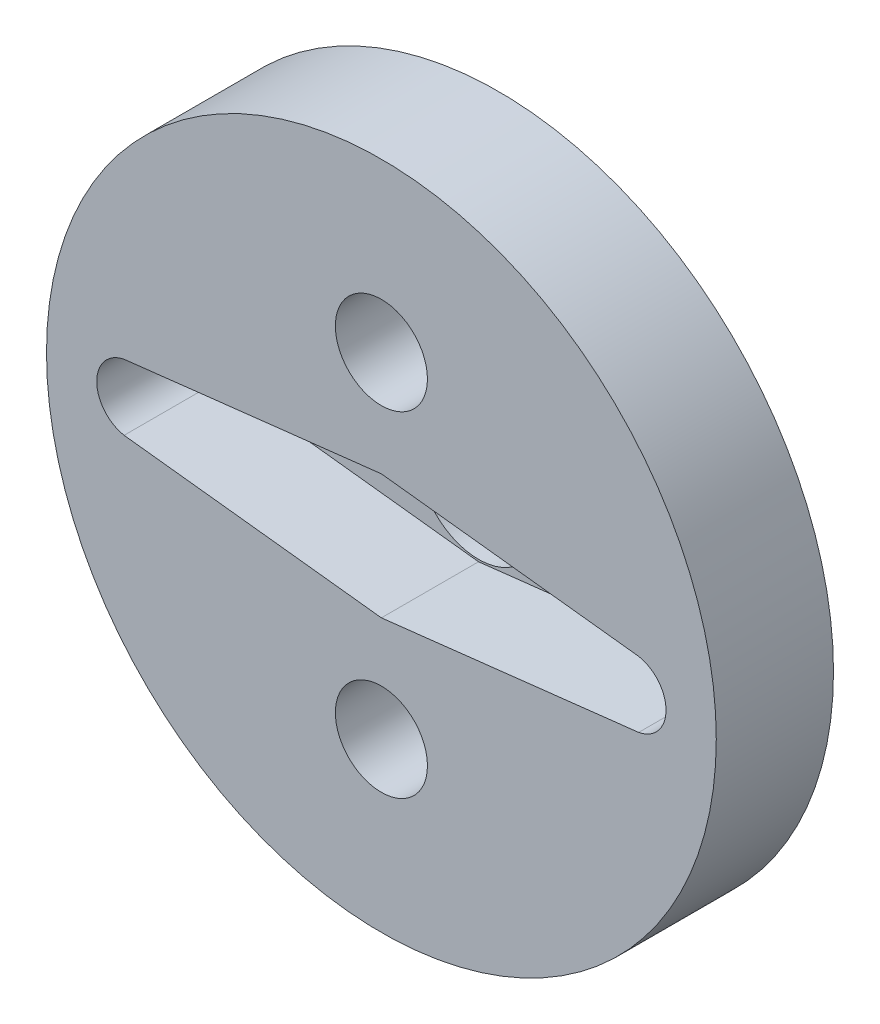
ISO-10303-21;
HEADER;
FILE_DESCRIPTION(('STEP AP214'),'2;1');
FILE_NAME('part.step','',(''),(''),'','','');
FILE_SCHEMA(('AUTOMOTIVE_DESIGN { 1 0 10303 214 1 1 1 1 }'));
ENDSEC;
DATA;
#1=APPLICATION_CONTEXT('core data for automotive mechanical design processes');
#2=APPLICATION_PROTOCOL_DEFINITION('international standard','automotive_design',2000,#1);
#3=PRODUCT_CONTEXT('',#1,'mechanical');
#4=PRODUCT('Part','Part','',(#3));
#5=PRODUCT_RELATED_PRODUCT_CATEGORY('part','',(#4));
#6=PRODUCT_DEFINITION_FORMATION('','',#4);
#7=PRODUCT_DEFINITION_CONTEXT('part definition',#1,'design');
#8=PRODUCT_DEFINITION('design','',#6,#7);
#9=PRODUCT_DEFINITION_SHAPE('','',#8);
#10=(LENGTH_UNIT() NAMED_UNIT(*) SI_UNIT(.MILLI.,.METRE.));
#11=(NAMED_UNIT(*) PLANE_ANGLE_UNIT() SI_UNIT($,.RADIAN.));
#12=(NAMED_UNIT(*) SI_UNIT($,.STERADIAN.) SOLID_ANGLE_UNIT());
#13=UNCERTAINTY_MEASURE_WITH_UNIT(LENGTH_MEASURE(1.E-05),#10,'distance_accuracy_value','');
#14=(GEOMETRIC_REPRESENTATION_CONTEXT(3) GLOBAL_UNCERTAINTY_ASSIGNED_CONTEXT((#13)) GLOBAL_UNIT_ASSIGNED_CONTEXT((#10,
#11,#12)) REPRESENTATION_CONTEXT('',''));
#15=CARTESIAN_POINT('',(0.,0.,0.));
#16=DIRECTION('',(0.,0.,1.));
#17=DIRECTION('',(1.,0.,0.));
#18=AXIS2_PLACEMENT_3D('',#15,#16,#17);
#19=CARTESIAN_POINT('',(7.3114484627872E-06,4.64266431529568E-06,45.0639905349175));
#20=DIRECTION('',(0.,0.,-1.));
#21=DIRECTION('',(-1.,0.,0.));
#22=AXIS2_PLACEMENT_3D('',#19,#20,#21);
#23=CYLINDRICAL_SURFACE('',#22,20.);
#24=CARTESIAN_POINT('',(7.3114484627872E-06,4.64266431529568E-06,9.70331160988214));
#25=DIRECTION('',(0.,0.,1.));
#26=DIRECTION('',(1.,0.,0.));
#27=AXIS2_PLACEMENT_3D('',#24,#25,#26);
#28=CIRCLE('',#27,20.);
#29=CARTESIAN_POINT('',(20.0000073114485,4.64266431529568E-06,9.70331160988214));
#30=VERTEX_POINT('',#29);
#31=EDGE_CURVE('E67',#30,#30,#28,.T.);
#32=ORIENTED_EDGE('',*,*,#31,.T.);
#33=EDGE_LOOP('',(#32));
#34=FACE_BOUND('',#33,.T.);
#35=CARTESIAN_POINT('',(7.3114484627872E-06,4.64266431529568E-06,16.7033116098821));
#36=DIRECTION('',(0.,0.,1.));
#37=DIRECTION('',(1.,0.,0.));
#38=AXIS2_PLACEMENT_3D('',#35,#36,#37);
#39=CIRCLE('',#38,20.);
#40=CARTESIAN_POINT('',(20.0000073114485,4.64266431529568E-06,16.7033116098821));
#41=VERTEX_POINT('',#40);
#42=EDGE_CURVE('E122',#41,#41,#39,.T.);
#43=ORIENTED_EDGE('',*,*,#42,.F.);
#44=EDGE_LOOP('',(#43));
#45=FACE_BOUND('',#44,.T.);
#46=ADVANCED_FACE('F59',(#34,#45),#23,.T.);
#47=CARTESIAN_POINT('',(15.0000000000054,0.,10.9033116098821));
#48=DIRECTION('',(0.,0.,1.));
#49=DIRECTION('',(1.,0.,0.));
#50=AXIS2_PLACEMENT_3D('',#47,#48,#49);
#51=CYLINDRICAL_SURFACE('',#50,2.);
#52=CARTESIAN_POINT('',(15.0000000000054,0.,16.7033116098821));
#53=DIRECTION('',(0.,0.,1.));
#54=DIRECTION('',(1.,0.,0.));
#55=AXIS2_PLACEMENT_3D('',#52,#53,#54);
#56=CIRCLE('',#55,2.);
#57=CARTESIAN_POINT('',(15.3650749142276,1.96639779978662,16.7033116098821));
#58=VERTEX_POINT('',#57);
#59=CARTESIAN_POINT('',(15.3650846141353,-1.96639599890907,16.7033116098821));
#60=VERTEX_POINT('',#59);
#61=EDGE_CURVE('E113',#58,#60,#56,.F.);
#62=ORIENTED_EDGE('',*,*,#61,.F.);
#63=DIRECTION('',(0.,0.,1.));
#64=VECTOR('',#63,1.);
#65=CARTESIAN_POINT('',(15.3650749142276,1.96639779978662,10.9033116098821));
#66=LINE('',#65,#64);
#67=CARTESIAN_POINT('',(15.3650749142276,1.96639779978662,10.9033116098821));
#68=VERTEX_POINT('',#67);
#69=EDGE_CURVE('E119',#68,#58,#66,.T.);
#70=ORIENTED_EDGE('',*,*,#69,.F.);
#71=CARTESIAN_POINT('',(15.0000000000054,0.,10.9033116098821));
#72=DIRECTION('',(0.,0.,1.));
#73=DIRECTION('',(-1.,0.,0.));
#74=AXIS2_PLACEMENT_3D('',#71,#72,#73);
#75=CIRCLE('',#74,2.);
#76=CARTESIAN_POINT('',(15.3650846141353,-1.96639599890907,10.9033116098821));
#77=VERTEX_POINT('',#76);
#78=EDGE_CURVE('E147',#77,#68,#75,.T.);
#79=ORIENTED_EDGE('',*,*,#78,.F.);
#80=DIRECTION('',(0.,0.,1.));
#81=VECTOR('',#80,1.);
#82=CARTESIAN_POINT('',(15.3650846141353,-1.96639599890907,10.9033116098821));
#83=LINE('',#82,#81);
#84=EDGE_CURVE('E81',#77,#60,#83,.T.);
#85=ORIENTED_EDGE('',*,*,#84,.T.);
#86=EDGE_LOOP('',(#62,#70,#79,#85));
#87=FACE_BOUND('',#86,.T.);
#88=ADVANCED_FACE('F118',(#87),#51,.F.);
#89=CARTESIAN_POINT('',(15.3650846141353,-1.96639599890907,10.9033116098821));
#90=DIRECTION('',(0.113651255882556,-0.99352070538883,0.));
#91=DIRECTION('',(0.99352070538883,0.113651255882556,0.));
#92=AXIS2_PLACEMENT_3D('',#89,#90,#91);
#93=PLANE('',#92);
#94=DIRECTION('',(-0.99352070538883,-0.113651255882556,0.));
#95=VECTOR('',#94,1.);
#96=CARTESIAN_POINT('',(15.3650846141353,-1.96639599890907,16.7033116098821));
#97=LINE('',#96,#95);
#98=CARTESIAN_POINT('',(0.,-3.72404549092925,16.7033116098821));
#99=VERTEX_POINT('',#98);
#100=EDGE_CURVE('E123',#60,#99,#97,.T.);
#101=ORIENTED_EDGE('',*,*,#100,.F.);
#102=ORIENTED_EDGE('',*,*,#84,.F.);
#103=DIRECTION('',(0.99352070538883,0.113651255882556,0.));
#104=VECTOR('',#103,1.);
#105=CARTESIAN_POINT('',(15.3650846141353,-1.96639599890907,10.9033116098821));
#106=LINE('',#105,#104);
#107=CARTESIAN_POINT('',(0.,-3.72404549092925,10.9033116098821));
#108=VERTEX_POINT('',#107);
#109=EDGE_CURVE('E131',#108,#77,#106,.T.);
#110=ORIENTED_EDGE('',*,*,#109,.F.);
#111=DIRECTION('',(0.,0.,1.));
#112=VECTOR('',#111,1.);
#113=CARTESIAN_POINT('',(0.,-3.72404549092925,10.9033116098821));
#114=LINE('',#113,#112);
#115=EDGE_CURVE('E177',#108,#99,#114,.T.);
#116=ORIENTED_EDGE('',*,*,#115,.T.);
#117=EDGE_LOOP('',(#101,#102,#110,#116));
#118=FACE_BOUND('',#117,.T.);
#119=ADVANCED_FACE('F215',(#118),#93,.F.);
#120=CARTESIAN_POINT('',(-15.3650846141353,-1.96639599890907,10.9033116098821));
#121=DIRECTION('',(-0.113651255882555,-0.99352070538883,0.));
#122=DIRECTION('',(0.99352070538883,-0.113651255882556,0.));
#123=AXIS2_PLACEMENT_3D('',#120,#121,#122);
#124=PLANE('',#123);
#125=DIRECTION('',(-0.99352070538883,0.113651255882556,0.));
#126=VECTOR('',#125,1.);
#127=CARTESIAN_POINT('',(-15.3650846141353,-1.96639599890907,16.7033116098821));
#128=LINE('',#127,#126);
#129=CARTESIAN_POINT('',(-15.3650846141353,-1.96639599890907,16.7033116098821));
#130=VERTEX_POINT('',#129);
#131=EDGE_CURVE('E199',#99,#130,#128,.T.);
#132=ORIENTED_EDGE('',*,*,#131,.F.);
#133=ORIENTED_EDGE('',*,*,#115,.F.);
#134=DIRECTION('',(0.99352070538883,-0.113651255882555,0.));
#135=VECTOR('',#134,1.);
#136=CARTESIAN_POINT('',(-15.3650846141353,-1.96639599890907,10.9033116098821));
#137=LINE('',#136,#135);
#138=CARTESIAN_POINT('',(-15.3650846141353,-1.96639599890907,10.9033116098821));
#139=VERTEX_POINT('',#138);
#140=EDGE_CURVE('E138',#139,#108,#137,.T.);
#141=ORIENTED_EDGE('',*,*,#140,.F.);
#142=DIRECTION('',(0.,0.,1.));
#143=VECTOR('',#142,1.);
#144=CARTESIAN_POINT('',(-15.3650846141353,-1.96639599890907,10.9033116098821));
#145=LINE('',#144,#143);
#146=EDGE_CURVE('E181',#139,#130,#145,.T.);
#147=ORIENTED_EDGE('',*,*,#146,.T.);
#148=EDGE_LOOP('',(#132,#133,#141,#147));
#149=FACE_BOUND('',#148,.T.);
#150=ADVANCED_FACE('F213',(#149),#124,.F.);
#151=CARTESIAN_POINT('',(-15.0000000000054,0.,10.9033116098821));
#152=DIRECTION('',(0.,0.,1.));
#153=DIRECTION('',(1.,0.,0.));
#154=AXIS2_PLACEMENT_3D('',#151,#152,#153);
#155=CYLINDRICAL_SURFACE('',#154,2.);
#156=CARTESIAN_POINT('',(-15.0000000000054,0.,16.7033116098821));
#157=DIRECTION('',(0.,0.,1.));
#158=DIRECTION('',(1.,0.,0.));
#159=AXIS2_PLACEMENT_3D('',#156,#157,#158);
#160=CIRCLE('',#159,2.);
#161=CARTESIAN_POINT('',(-15.3650749142276,1.96639779978661,16.7033116098821));
#162=VERTEX_POINT('',#161);
#163=EDGE_CURVE('E190',#130,#162,#160,.F.);
#164=ORIENTED_EDGE('',*,*,#163,.F.);
#165=ORIENTED_EDGE('',*,*,#146,.F.);
#166=CARTESIAN_POINT('',(-15.0000000000054,0.,10.9033116098821));
#167=DIRECTION('',(0.,0.,1.));
#168=DIRECTION('',(1.,0.,0.));
#169=AXIS2_PLACEMENT_3D('',#166,#167,#168);
#170=CIRCLE('',#169,2.);
#171=CARTESIAN_POINT('',(-15.3650749142276,1.96639779978661,10.9033116098821));
#172=VERTEX_POINT('',#171);
#173=EDGE_CURVE('E168',#172,#139,#170,.T.);
#174=ORIENTED_EDGE('',*,*,#173,.F.);
#175=DIRECTION('',(0.,0.,1.));
#176=VECTOR('',#175,1.);
#177=CARTESIAN_POINT('',(-15.3650749142276,1.96639779978661,10.9033116098821));
#178=LINE('',#177,#176);
#179=EDGE_CURVE('E135',#172,#162,#178,.T.);
#180=ORIENTED_EDGE('',*,*,#179,.T.);
#181=EDGE_LOOP('',(#164,#165,#174,#180));
#182=FACE_BOUND('',#181,.T.);
#183=ADVANCED_FACE('F189',(#182),#155,.F.);
#184=CARTESIAN_POINT('',(-15.3650749142276,1.96639779978661,10.9033116098821));
#185=DIRECTION('',(-0.113656738672884,0.993520078183749,0.));
#186=DIRECTION('',(-0.99352007818375,-0.113656738672884,0.));
#187=AXIS2_PLACEMENT_3D('',#184,#185,#186);
#188=PLANE('',#187);
#189=DIRECTION('',(0.99352007818375,0.113656738672884,0.));
#190=VECTOR('',#189,1.);
#191=CARTESIAN_POINT('',(-15.3650749142276,1.96639779978661,16.7033116098821));
#192=LINE('',#191,#190);
#193=CARTESIAN_POINT('',(0.,3.72413208474252,16.7033116098821));
#194=VERTEX_POINT('',#193);
#195=EDGE_CURVE('E73',#162,#194,#192,.T.);
#196=ORIENTED_EDGE('',*,*,#195,.F.);
#197=ORIENTED_EDGE('',*,*,#179,.F.);
#198=DIRECTION('',(-0.993520078183749,-0.113656738672884,0.));
#199=VECTOR('',#198,1.);
#200=CARTESIAN_POINT('',(-15.3650749142276,1.96639779978661,10.9033116098821));
#201=LINE('',#200,#199);
#202=CARTESIAN_POINT('',(0.,3.72413208474252,10.9033116098821));
#203=VERTEX_POINT('',#202);
#204=EDGE_CURVE('E164',#203,#172,#201,.T.);
#205=ORIENTED_EDGE('',*,*,#204,.F.);
#206=DIRECTION('',(0.,0.,1.));
#207=VECTOR('',#206,1.);
#208=CARTESIAN_POINT('',(0.,3.72413208474252,10.9033116098821));
#209=LINE('',#208,#207);
#210=EDGE_CURVE('E130',#203,#194,#209,.T.);
#211=ORIENTED_EDGE('',*,*,#210,.T.);
#212=EDGE_LOOP('',(#196,#197,#205,#211));
#213=FACE_BOUND('',#212,.T.);
#214=ADVANCED_FACE('F193',(#213),#188,.F.);
#215=CARTESIAN_POINT('',(15.3650749142276,1.96639779978662,10.9033116098821));
#216=DIRECTION('',(0.113656738672884,0.99352007818375,0.));
#217=DIRECTION('',(-0.99352007818375,0.113656738672884,0.));
#218=AXIS2_PLACEMENT_3D('',#215,#216,#217);
#219=PLANE('',#218);
#220=DIRECTION('',(0.99352007818375,-0.113656738672884,0.));
#221=VECTOR('',#220,1.);
#222=CARTESIAN_POINT('',(15.3650749142276,1.96639779978662,16.7033116098821));
#223=LINE('',#222,#221);
#224=EDGE_CURVE('E12',#194,#58,#223,.T.);
#225=ORIENTED_EDGE('',*,*,#224,.F.);
#226=ORIENTED_EDGE('',*,*,#210,.F.);
#227=DIRECTION('',(-0.99352007818375,0.113656738672884,0.));
#228=VECTOR('',#227,1.);
#229=CARTESIAN_POINT('',(15.3650749142276,1.96639779978662,10.9033116098821));
#230=LINE('',#229,#228);
#231=EDGE_CURVE('E127',#68,#203,#230,.T.);
#232=ORIENTED_EDGE('',*,*,#231,.F.);
#233=ORIENTED_EDGE('',*,*,#69,.T.);
#234=EDGE_LOOP('',(#225,#226,#232,#233));
#235=FACE_BOUND('',#234,.T.);
#236=ADVANCED_FACE('F125',(#235),#219,.F.);
#237=CARTESIAN_POINT('',(7.3114484627872E-06,4.64266431529568E-06,9.70331160988214));
#238=DIRECTION('',(0.,0.,1.));
#239=DIRECTION('',(1.,0.,0.));
#240=AXIS2_PLACEMENT_3D('',#237,#238,#239);
#241=PLANE('',#240);
#242=CARTESIAN_POINT('',(7.3114484627874E-06,4.64266431530092E-06,9.70331160988214));
#243=DIRECTION('',(0.,0.,-1.));
#244=DIRECTION('',(-1.,0.,0.));
#245=AXIS2_PLACEMENT_3D('',#242,#243,#244);
#246=CIRCLE('',#245,3.6);
#247=CARTESIAN_POINT('',(-3.59999268855154,4.64266431530092E-06,9.70331160988214));
#248=VERTEX_POINT('',#247);
#249=EDGE_CURVE('E148',#248,#248,#246,.T.);
#250=ORIENTED_EDGE('',*,*,#249,.F.);
#251=EDGE_LOOP('',(#250));
#252=FACE_BOUND('',#251,.T.);
#253=ORIENTED_EDGE('',*,*,#31,.F.);
#254=EDGE_LOOP('',(#253));
#255=FACE_BOUND('',#254,.T.);
#256=ADVANCED_FACE('F220',(#252,#255),#241,.F.);
#257=CARTESIAN_POINT('',(15.0000000000054,0.,10.9033116098821));
#258=DIRECTION('',(0.,0.,-1.));
#259=DIRECTION('',(-1.,0.,0.));
#260=AXIS2_PLACEMENT_3D('',#257,#258,#259);
#261=PLANE('',#260);
#262=CARTESIAN_POINT('',(7.3114484627874E-06,4.64266431530092E-06,10.9033116098821));
#263=DIRECTION('',(0.,0.,-1.));
#264=DIRECTION('',(-1.,0.,0.));
#265=AXIS2_PLACEMENT_3D('',#262,#263,#264);
#266=CIRCLE('',#265,3.6);
#267=CARTESIAN_POINT('',(-3.59999268855154,4.64266431530092E-06,10.9033116098821));
#268=VERTEX_POINT('',#267);
#269=EDGE_CURVE('E144',#268,#268,#266,.T.);
#270=ORIENTED_EDGE('',*,*,#269,.T.);
#271=EDGE_LOOP('',(#270));
#272=FACE_BOUND('',#271,.T.);
#273=ORIENTED_EDGE('',*,*,#78,.T.);
#274=ORIENTED_EDGE('',*,*,#231,.T.);
#275=ORIENTED_EDGE('',*,*,#204,.T.);
#276=ORIENTED_EDGE('',*,*,#173,.T.);
#277=ORIENTED_EDGE('',*,*,#140,.T.);
#278=ORIENTED_EDGE('',*,*,#109,.T.);
#279=EDGE_LOOP('',(#273,#274,#275,#276,#277,#278));
#280=FACE_BOUND('',#279,.T.);
#281=ADVANCED_FACE('F217',(#272,#280),#261,.F.);
#282=CARTESIAN_POINT('',(7.3114484627874E-06,4.64266431530092E-06,15.1033116098821));
#283=DIRECTION('',(0.,0.,-1.));
#284=DIRECTION('',(-1.,0.,0.));
#285=AXIS2_PLACEMENT_3D('',#282,#283,#284);
#286=CYLINDRICAL_SURFACE('',#285,3.6);
#287=CARTESIAN_POINT('',(-3.59999268855154,4.64266431530092E-06,9.70331160988214));
#288=CARTESIAN_POINT('',(-3.59999268855154,4.64266431530092E-06,9.71581160988214));
#289=CARTESIAN_POINT('',(-3.59999268855154,4.64266431530092E-06,9.72831160988214));
#290=CARTESIAN_POINT('',(-3.59999268855154,4.64266431530092E-06,9.75331160988214));
#291=CARTESIAN_POINT('',(-3.59999268855154,4.64266431530092E-06,9.76581160988214));
#292=CARTESIAN_POINT('',(-3.59999268855154,4.64266431530092E-06,9.79081160988214));
#293=CARTESIAN_POINT('',(-3.59999268855154,4.64266431530092E-06,9.80331160988214));
#294=CARTESIAN_POINT('',(-3.59999268855154,4.64266431530092E-06,9.82831160988214));
#295=CARTESIAN_POINT('',(-3.59999268855154,4.64266431530092E-06,9.84081160988214));
#296=CARTESIAN_POINT('',(-3.59999268855154,4.64266431530092E-06,9.86581160988214));
#297=CARTESIAN_POINT('',(-3.59999268855154,4.64266431530092E-06,9.87831160988214));
#298=CARTESIAN_POINT('',(-3.59999268855154,4.64266431530092E-06,9.90331160988214));
#299=CARTESIAN_POINT('',(-3.59999268855154,4.64266431530092E-06,9.91581160988214));
#300=CARTESIAN_POINT('',(-3.59999268855154,4.64266431530092E-06,9.94081160988214));
#301=CARTESIAN_POINT('',(-3.59999268855154,4.64266431530092E-06,9.95331160988214));
#302=CARTESIAN_POINT('',(-3.59999268855154,4.64266431530092E-06,9.97831160988214));
#303=CARTESIAN_POINT('',(-3.59999268855154,4.64266431530092E-06,9.99081160988214));
#304=CARTESIAN_POINT('',(-3.59999268855154,4.64266431530092E-06,10.0158116098821));
#305=CARTESIAN_POINT('',(-3.59999268855154,4.64266431530092E-06,10.0283116098821));
#306=CARTESIAN_POINT('',(-3.59999268855154,4.64266431530092E-06,10.0533116098821));
#307=CARTESIAN_POINT('',(-3.59999268855154,4.64266431530092E-06,10.0658116098821));
#308=CARTESIAN_POINT('',(-3.59999268855154,4.64266431530092E-06,10.0908116098821));
#309=CARTESIAN_POINT('',(-3.59999268855154,4.64266431530092E-06,10.1033116098821));
#310=CARTESIAN_POINT('',(-3.59999268855154,4.64266431530092E-06,10.1283116098821));
#311=CARTESIAN_POINT('',(-3.59999268855154,4.64266431530092E-06,10.1408116098821));
#312=CARTESIAN_POINT('',(-3.59999268855154,4.64266431530092E-06,10.1658116098821));
#313=CARTESIAN_POINT('',(-3.59999268855154,4.64266431530092E-06,10.1783116098821));
#314=CARTESIAN_POINT('',(-3.59999268855154,4.64266431530092E-06,10.2033116098821));
#315=CARTESIAN_POINT('',(-3.59999268855154,4.64266431530092E-06,10.2158116098821));
#316=CARTESIAN_POINT('',(-3.59999268855154,4.64266431530092E-06,10.2408116098821));
#317=CARTESIAN_POINT('',(-3.59999268855154,4.64266431530092E-06,10.2533116098821));
#318=CARTESIAN_POINT('',(-3.59999268855154,4.64266431530092E-06,10.2783116098821));
#319=CARTESIAN_POINT('',(-3.59999268855154,4.64266431530092E-06,10.2908116098821));
#320=CARTESIAN_POINT('',(-3.59999268855154,4.64266431530092E-06,10.3158116098821));
#321=CARTESIAN_POINT('',(-3.59999268855154,4.64266431530092E-06,10.3283116098821));
#322=CARTESIAN_POINT('',(-3.59999268855154,4.64266431530092E-06,10.3533116098821));
#323=CARTESIAN_POINT('',(-3.59999268855154,4.64266431530092E-06,10.3658116098821));
#324=CARTESIAN_POINT('',(-3.59999268855154,4.64266431530092E-06,10.3908116098821));
#325=CARTESIAN_POINT('',(-3.59999268855154,4.64266431530092E-06,10.4033116098821));
#326=CARTESIAN_POINT('',(-3.59999268855154,4.64266431530092E-06,10.4283116098821));
#327=CARTESIAN_POINT('',(-3.59999268855154,4.64266431530092E-06,10.4408116098821));
#328=CARTESIAN_POINT('',(-3.59999268855154,4.64266431530092E-06,10.4658116098821));
#329=CARTESIAN_POINT('',(-3.59999268855154,4.64266431530092E-06,10.4783116098821));
#330=CARTESIAN_POINT('',(-3.59999268855154,4.64266431530092E-06,10.5033116098821));
#331=CARTESIAN_POINT('',(-3.59999268855154,4.64266431530092E-06,10.5158116098821));
#332=CARTESIAN_POINT('',(-3.59999268855154,4.64266431530092E-06,10.5408116098821));
#333=CARTESIAN_POINT('',(-3.59999268855154,4.64266431530092E-06,10.5533116098821));
#334=CARTESIAN_POINT('',(-3.59999268855154,4.64266431530092E-06,10.5783116098821));
#335=CARTESIAN_POINT('',(-3.59999268855154,4.64266431530092E-06,10.5908116098821));
#336=CARTESIAN_POINT('',(-3.59999268855154,4.64266431530092E-06,10.6158116098821));
#337=CARTESIAN_POINT('',(-3.59999268855154,4.64266431530092E-06,10.6283116098821));
#338=CARTESIAN_POINT('',(-3.59999268855154,4.64266431530092E-06,10.6533116098821));
#339=CARTESIAN_POINT('',(-3.59999268855154,4.64266431530092E-06,10.6658116098821));
#340=CARTESIAN_POINT('',(-3.59999268855154,4.64266431530092E-06,10.6908116098821));
#341=CARTESIAN_POINT('',(-3.59999268855154,4.64266431530092E-06,10.7033116098821));
#342=CARTESIAN_POINT('',(-3.59999268855154,4.64266431530092E-06,10.7283116098821));
#343=CARTESIAN_POINT('',(-3.59999268855154,4.64266431530092E-06,10.7408116098821));
#344=CARTESIAN_POINT('',(-3.59999268855154,4.64266431530092E-06,10.7658116098821));
#345=CARTESIAN_POINT('',(-3.59999268855154,4.64266431530092E-06,10.7783116098821));
#346=CARTESIAN_POINT('',(-3.59999268855154,4.64266431530092E-06,10.8033116098821));
#347=CARTESIAN_POINT('',(-3.59999268855154,4.64266431530092E-06,10.8158116098821));
#348=CARTESIAN_POINT('',(-3.59999268855154,4.64266431530092E-06,10.8408116098821));
#349=CARTESIAN_POINT('',(-3.59999268855154,4.64266431530092E-06,10.8533116098821));
#350=CARTESIAN_POINT('',(-3.59999268855154,4.64266431530092E-06,10.8783116098821));
#351=CARTESIAN_POINT('',(-3.59999268855154,4.64266431530092E-06,10.8908116098821));
#352=CARTESIAN_POINT('',(-3.59999268855154,4.64266431530092E-06,10.9033116098821));
#353=B_SPLINE_CURVE_WITH_KNOTS('',3,(#287,#288,#289,#290,#291,#292,#293,#294,#295,#296,#297,
#298,#299,#300,#301,#302,#303,#304,#305,#306,#307,#308,#309,#310,#311,#312,#313,#314,#315,#316,
#317,#318,#319,#320,#321,#322,#323,#324,#325,#326,#327,#328,#329,#330,#331,#332,#333,#334,#335,
#336,#337,#338,#339,#340,#341,#342,#343,#344,#345,#346,#347,#348,#349,#350,#351,#352),
.UNSPECIFIED.,.F.,.F.,(4,2,2,2,2,2,2,2,2,2,2,2,2,2,2,2,2,2,2,2,2,2,2,2,2,2,2,2,2,2,2,2,4),(0.,
0.0375000000000011,0.0750000000000021,0.112500000000001,0.150000000000001,0.1875,0.225,
0.262500000000001,0.300000000000002,0.337500000000001,0.375,0.4125,0.450000000000001,
0.487500000000002,0.525000000000001,0.5625,0.6,0.637500000000001,0.675000000000002,
0.712500000000001,0.750000000000001,0.7875,0.824999999999999,0.8625,0.900000000000001,
0.937500000000001,0.975,1.0125,1.05,1.0875,1.125,1.1625,1.2),.UNSPECIFIED.);
#354=EDGE_CURVE('BSEAM219',#248,#268,#353,.T.);
#355=ORIENTED_EDGE('',*,*,#249,.T.);
#356=ORIENTED_EDGE('',*,*,#269,.F.);
#357=ORIENTED_EDGE('',*,*,#354,.T.);
#358=ORIENTED_EDGE('',*,*,#354,.F.);
#359=EDGE_LOOP('',(#355,#357,#356,#358));
#360=FACE_BOUND('',#359,.T.);
#361=ADVANCED_FACE('F219',(#360),#286,.F.);
#362=CARTESIAN_POINT('',(0.00935962319433556,0.215183115524063,16.7033116098821));
#363=DIRECTION('',(0.,0.,1.));
#364=DIRECTION('',(1.,0.,0.));
#365=AXIS2_PLACEMENT_3D('',#362,#363,#364);
#366=PLANE('',#365);
#367=CARTESIAN_POINT('',(0.,10.,16.7033116098821));
#368=DIRECTION('',(0.,0.,1.));
#369=DIRECTION('',(1.,0.,0.));
#370=AXIS2_PLACEMENT_3D('',#367,#368,#369);
#371=CIRCLE('',#370,2.75);
#372=CARTESIAN_POINT('',(2.75,10.,16.7033116098821));
#373=VERTEX_POINT('',#372);
#374=EDGE_CURVE('E202',#373,#373,#371,.T.);
#375=ORIENTED_EDGE('',*,*,#374,.F.);
#376=EDGE_LOOP('',(#375));
#377=FACE_BOUND('',#376,.T.);
#378=CARTESIAN_POINT('',(0.,-10.,16.7033116098821));
#379=DIRECTION('',(0.,0.,1.));
#380=DIRECTION('',(1.,0.,0.));
#381=AXIS2_PLACEMENT_3D('',#378,#379,#380);
#382=CIRCLE('',#381,2.75);
#383=CARTESIAN_POINT('',(2.75,-10.,16.7033116098821));
#384=VERTEX_POINT('',#383);
#385=EDGE_CURVE('E205',#384,#384,#382,.T.);
#386=ORIENTED_EDGE('',*,*,#385,.F.);
#387=EDGE_LOOP('',(#386));
#388=FACE_BOUND('',#387,.T.);
#389=ORIENTED_EDGE('',*,*,#61,.T.);
#390=ORIENTED_EDGE('',*,*,#100,.T.);
#391=ORIENTED_EDGE('',*,*,#131,.T.);
#392=ORIENTED_EDGE('',*,*,#163,.T.);
#393=ORIENTED_EDGE('',*,*,#195,.T.);
#394=ORIENTED_EDGE('',*,*,#224,.T.);
#395=EDGE_LOOP('',(#389,#390,#391,#392,#393,#394));
#396=FACE_BOUND('',#395,.T.);
#397=ORIENTED_EDGE('',*,*,#42,.T.);
#398=EDGE_LOOP('',(#397));
#399=FACE_BOUND('',#398,.T.);
#400=ADVANCED_FACE('F111',(#377,#388,#396,#399),#366,.T.);
#401=CARTESIAN_POINT('',(0.,-10.,10.7033116098821));
#402=DIRECTION('',(0.,0.,1.));
#403=DIRECTION('',(1.,0.,0.));
#404=AXIS2_PLACEMENT_3D('',#401,#402,#403);
#405=CYLINDRICAL_SURFACE('',#404,2.75);
#406=CARTESIAN_POINT('',(0.,-10.,10.7033116098821));
#407=DIRECTION('',(0.,0.,1.));
#408=DIRECTION('',(1.,0.,0.));
#409=AXIS2_PLACEMENT_3D('',#406,#407,#408);
#410=CIRCLE('',#409,2.75);
#411=CARTESIAN_POINT('',(2.75,-10.,10.7033116098821));
#412=VERTEX_POINT('',#411);
#413=EDGE_CURVE('E267',#412,#412,#410,.T.);
#414=ORIENTED_EDGE('',*,*,#413,.F.);
#415=EDGE_LOOP('',(#414));
#416=FACE_BOUND('',#415,.T.);
#417=ORIENTED_EDGE('',*,*,#385,.T.);
#418=EDGE_LOOP('',(#417));
#419=FACE_BOUND('',#418,.T.);
#420=ADVANCED_FACE('F239',(#416,#419),#405,.F.);
#421=CARTESIAN_POINT('',(0.,-10.,10.7033116098821));
#422=DIRECTION('',(0.,0.,1.));
#423=DIRECTION('',(1.,0.,0.));
#424=AXIS2_PLACEMENT_3D('',#421,#422,#423);
#425=PLANE('',#424);
#426=ORIENTED_EDGE('',*,*,#413,.T.);
#427=EDGE_LOOP('',(#426));
#428=FACE_BOUND('',#427,.T.);
#429=ADVANCED_FACE('F245',(#428),#425,.T.);
#430=CARTESIAN_POINT('',(0.,10.,10.7033116098821));
#431=DIRECTION('',(0.,0.,1.));
#432=DIRECTION('',(1.,0.,0.));
#433=AXIS2_PLACEMENT_3D('',#430,#431,#432);
#434=CYLINDRICAL_SURFACE('',#433,2.75);
#435=CARTESIAN_POINT('',(0.,10.,10.7033116098821));
#436=DIRECTION('',(0.,0.,1.));
#437=DIRECTION('',(1.,0.,0.));
#438=AXIS2_PLACEMENT_3D('',#435,#436,#437);
#439=CIRCLE('',#438,2.75);
#440=CARTESIAN_POINT('',(2.75,10.,10.7033116098821));
#441=VERTEX_POINT('',#440);
#442=EDGE_CURVE('E195',#441,#441,#439,.T.);
#443=ORIENTED_EDGE('',*,*,#442,.F.);
#444=EDGE_LOOP('',(#443));
#445=FACE_BOUND('',#444,.T.);
#446=ORIENTED_EDGE('',*,*,#374,.T.);
#447=EDGE_LOOP('',(#446));
#448=FACE_BOUND('',#447,.T.);
#449=ADVANCED_FACE('F253',(#445,#448),#434,.F.);
#450=CARTESIAN_POINT('',(0.,10.,10.7033116098821));
#451=DIRECTION('',(0.,0.,1.));
#452=DIRECTION('',(1.,0.,0.));
#453=AXIS2_PLACEMENT_3D('',#450,#451,#452);
#454=PLANE('',#453);
#455=ORIENTED_EDGE('',*,*,#442,.T.);
#456=EDGE_LOOP('',(#455));
#457=FACE_BOUND('',#456,.T.);
#458=ADVANCED_FACE('F257',(#457),#454,.T.);
#459=CLOSED_SHELL('',(#46,#88,#119,#150,#183,#214,#236,#256,#281,#361,#400,#420,#429,#449,#458));
#460=MANIFOLD_SOLID_BREP('B2',#459);
#461=ADVANCED_BREP_SHAPE_REPRESENTATION('',(#18,#460),#14);
#462=SHAPE_DEFINITION_REPRESENTATION(#9,#461);
ENDSEC;
END-ISO-10303-21;
